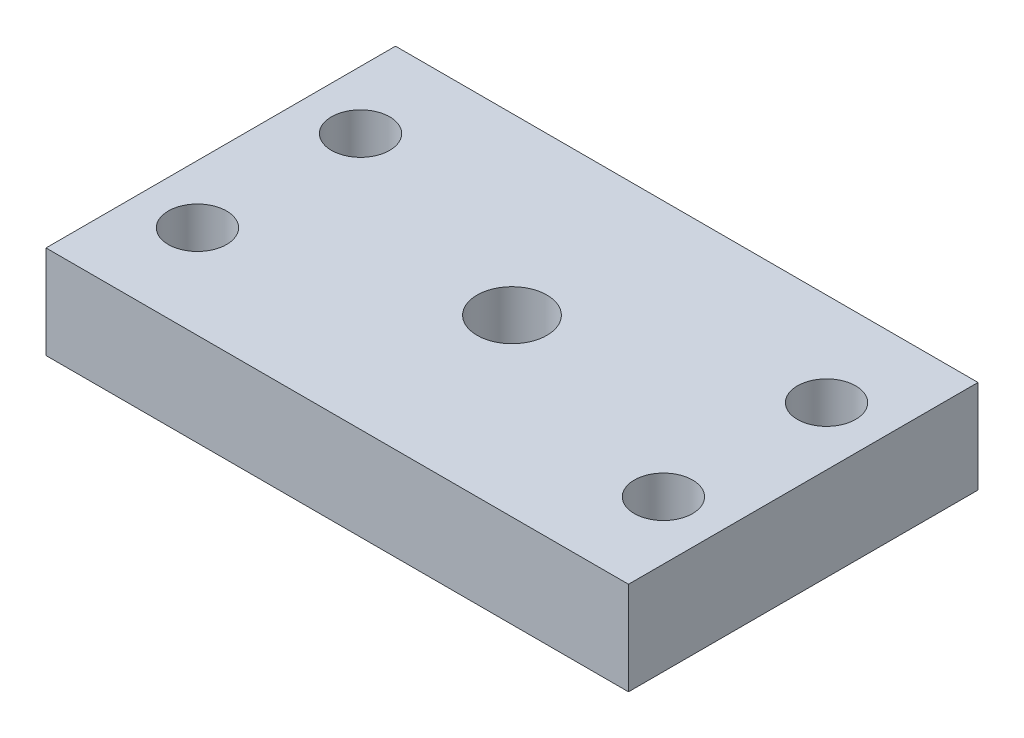
ISO-10303-21;
HEADER;
FILE_DESCRIPTION(('STEP AP214'),'2;1');
FILE_NAME('part.step','',(''),(''),'','','');
FILE_SCHEMA(('AUTOMOTIVE_DESIGN { 1 0 10303 214 1 1 1 1 }'));
ENDSEC;
DATA;
#1=APPLICATION_CONTEXT('core data for automotive mechanical design processes');
#2=APPLICATION_PROTOCOL_DEFINITION('international standard','automotive_design',2000,#1);
#3=PRODUCT_CONTEXT('',#1,'mechanical');
#4=PRODUCT('Part','Part','',(#3));
#5=PRODUCT_RELATED_PRODUCT_CATEGORY('part','',(#4));
#6=PRODUCT_DEFINITION_FORMATION('','',#4);
#7=PRODUCT_DEFINITION_CONTEXT('part definition',#1,'design');
#8=PRODUCT_DEFINITION('design','',#6,#7);
#9=PRODUCT_DEFINITION_SHAPE('','',#8);
#10=(LENGTH_UNIT() NAMED_UNIT(*) SI_UNIT(.MILLI.,.METRE.));
#11=(NAMED_UNIT(*) PLANE_ANGLE_UNIT() SI_UNIT($,.RADIAN.));
#12=(NAMED_UNIT(*) SI_UNIT($,.STERADIAN.) SOLID_ANGLE_UNIT());
#13=UNCERTAINTY_MEASURE_WITH_UNIT(LENGTH_MEASURE(1.E-05),#10,'distance_accuracy_value','');
#14=(GEOMETRIC_REPRESENTATION_CONTEXT(3) GLOBAL_UNCERTAINTY_ASSIGNED_CONTEXT((#13)) GLOBAL_UNIT_ASSIGNED_CONTEXT((#10,
#11,#12)) REPRESENTATION_CONTEXT('',''));
#15=CARTESIAN_POINT('',(0.,0.,0.));
#16=DIRECTION('',(0.,0.,1.));
#17=DIRECTION('',(1.,0.,0.));
#18=AXIS2_PLACEMENT_3D('',#15,#16,#17);
#19=CARTESIAN_POINT('',(0.,4.,0.));
#20=DIRECTION('',(1.,0.,0.));
#21=DIRECTION('',(0.,0.,-1.));
#22=AXIS2_PLACEMENT_3D('',#19,#20,#21);
#23=PLANE('',#22);
#24=DIRECTION('',(0.,0.,1.));
#25=VECTOR('',#24,1.);
#26=CARTESIAN_POINT('',(0.,0.,0.));
#27=LINE('',#26,#25);
#28=CARTESIAN_POINT('',(0.,0.,0.));
#29=VERTEX_POINT('',#28);
#30=CARTESIAN_POINT('',(0.,0.,15.));
#31=VERTEX_POINT('',#30);
#32=EDGE_CURVE('E100',#29,#31,#27,.T.);
#33=ORIENTED_EDGE('',*,*,#32,.T.);
#34=DIRECTION('',(0.,-1.,0.));
#35=VECTOR('',#34,1.);
#36=CARTESIAN_POINT('',(0.,4.,15.));
#37=LINE('',#36,#35);
#38=CARTESIAN_POINT('',(0.,4.,15.));
#39=VERTEX_POINT('',#38);
#40=EDGE_CURVE('E11',#39,#31,#37,.T.);
#41=ORIENTED_EDGE('',*,*,#40,.F.);
#42=DIRECTION('',(0.,0.,1.));
#43=VECTOR('',#42,1.);
#44=CARTESIAN_POINT('',(0.,4.,0.));
#45=LINE('',#44,#43);
#46=CARTESIAN_POINT('',(0.,4.,0.));
#47=VERTEX_POINT('',#46);
#48=EDGE_CURVE('E88',#47,#39,#45,.T.);
#49=ORIENTED_EDGE('',*,*,#48,.F.);
#50=DIRECTION('',(0.,-1.,0.));
#51=VECTOR('',#50,1.);
#52=CARTESIAN_POINT('',(0.,4.,0.));
#53=LINE('',#52,#51);
#54=EDGE_CURVE('E96',#47,#29,#53,.T.);
#55=ORIENTED_EDGE('',*,*,#54,.T.);
#56=EDGE_LOOP('',(#33,#41,#49,#55));
#57=FACE_BOUND('',#56,.T.);
#58=ADVANCED_FACE('F37',(#57),#23,.F.);
#59=CARTESIAN_POINT('',(0.,4.,15.));
#60=DIRECTION('',(0.,0.,-1.));
#61=DIRECTION('',(-1.,0.,0.));
#62=AXIS2_PLACEMENT_3D('',#59,#60,#61);
#63=PLANE('',#62);
#64=DIRECTION('',(1.,0.,0.));
#65=VECTOR('',#64,1.);
#66=CARTESIAN_POINT('',(0.,0.,15.));
#67=LINE('',#66,#65);
#68=CARTESIAN_POINT('',(25.,0.,15.));
#69=VERTEX_POINT('',#68);
#70=EDGE_CURVE('E92',#31,#69,#67,.T.);
#71=ORIENTED_EDGE('',*,*,#70,.T.);
#72=DIRECTION('',(0.,-1.,0.));
#73=VECTOR('',#72,1.);
#74=CARTESIAN_POINT('',(25.,4.,15.));
#75=LINE('',#74,#73);
#76=CARTESIAN_POINT('',(25.,4.,15.));
#77=VERTEX_POINT('',#76);
#78=EDGE_CURVE('E45',#77,#69,#75,.T.);
#79=ORIENTED_EDGE('',*,*,#78,.F.);
#80=DIRECTION('',(1.,0.,0.));
#81=VECTOR('',#80,1.);
#82=CARTESIAN_POINT('',(0.,4.,15.));
#83=LINE('',#82,#81);
#84=EDGE_CURVE('E83',#39,#77,#83,.T.);
#85=ORIENTED_EDGE('',*,*,#84,.F.);
#86=ORIENTED_EDGE('',*,*,#40,.T.);
#87=EDGE_LOOP('',(#71,#79,#85,#86));
#88=FACE_BOUND('',#87,.T.);
#89=ADVANCED_FACE('F91',(#88),#63,.F.);
#90=CARTESIAN_POINT('',(25.,4.,0.));
#91=DIRECTION('',(-1.,0.,0.));
#92=DIRECTION('',(0.,0.,1.));
#93=AXIS2_PLACEMENT_3D('',#90,#91,#92);
#94=PLANE('',#93);
#95=DIRECTION('',(0.,0.,-1.));
#96=VECTOR('',#95,1.);
#97=CARTESIAN_POINT('',(25.,0.,0.));
#98=LINE('',#97,#96);
#99=CARTESIAN_POINT('',(25.,0.,0.));
#100=VERTEX_POINT('',#99);
#101=EDGE_CURVE('E70',#69,#100,#98,.T.);
#102=ORIENTED_EDGE('',*,*,#101,.T.);
#103=DIRECTION('',(0.,-1.,0.));
#104=VECTOR('',#103,1.);
#105=CARTESIAN_POINT('',(25.,4.,0.));
#106=LINE('',#105,#104);
#107=CARTESIAN_POINT('',(25.,4.,0.));
#108=VERTEX_POINT('',#107);
#109=EDGE_CURVE('E93',#108,#100,#106,.T.);
#110=ORIENTED_EDGE('',*,*,#109,.F.);
#111=DIRECTION('',(0.,0.,-1.));
#112=VECTOR('',#111,1.);
#113=CARTESIAN_POINT('',(25.,4.,0.));
#114=LINE('',#113,#112);
#115=EDGE_CURVE('E86',#77,#108,#114,.T.);
#116=ORIENTED_EDGE('',*,*,#115,.F.);
#117=ORIENTED_EDGE('',*,*,#78,.T.);
#118=EDGE_LOOP('',(#102,#110,#116,#117));
#119=FACE_BOUND('',#118,.T.);
#120=ADVANCED_FACE('F94',(#119),#94,.F.);
#121=CARTESIAN_POINT('',(0.,4.,0.));
#122=DIRECTION('',(0.,0.,1.));
#123=DIRECTION('',(1.,0.,0.));
#124=AXIS2_PLACEMENT_3D('',#121,#122,#123);
#125=PLANE('',#124);
#126=DIRECTION('',(-1.,0.,0.));
#127=VECTOR('',#126,1.);
#128=CARTESIAN_POINT('',(0.,0.,0.));
#129=LINE('',#128,#127);
#130=EDGE_CURVE('E76',#100,#29,#129,.T.);
#131=ORIENTED_EDGE('',*,*,#130,.T.);
#132=ORIENTED_EDGE('',*,*,#54,.F.);
#133=DIRECTION('',(-1.,0.,0.));
#134=VECTOR('',#133,1.);
#135=CARTESIAN_POINT('',(0.,4.,0.));
#136=LINE('',#135,#134);
#137=EDGE_CURVE('E53',#108,#47,#136,.T.);
#138=ORIENTED_EDGE('',*,*,#137,.F.);
#139=ORIENTED_EDGE('',*,*,#109,.T.);
#140=EDGE_LOOP('',(#131,#132,#138,#139));
#141=FACE_BOUND('',#140,.T.);
#142=ADVANCED_FACE('F108',(#141),#125,.F.);
#143=CARTESIAN_POINT('',(0.,4.,0.));
#144=DIRECTION('',(0.,1.,0.));
#145=DIRECTION('',(0.,0.,1.));
#146=AXIS2_PLACEMENT_3D('',#143,#144,#145);
#147=PLANE('',#146);
#148=CARTESIAN_POINT('',(12.5,4.,7.5));
#149=DIRECTION('',(0.,1.,0.));
#150=DIRECTION('',(0.,0.,1.));
#151=AXIS2_PLACEMENT_3D('',#148,#149,#150);
#152=CIRCLE('',#151,1.5);
#153=CARTESIAN_POINT('',(12.5,4.,9.));
#154=VERTEX_POINT('',#153);
#155=EDGE_CURVE('E120',#154,#154,#152,.T.);
#156=ORIENTED_EDGE('',*,*,#155,.F.);
#157=EDGE_LOOP('',(#156));
#158=FACE_BOUND('',#157,.T.);
#159=CARTESIAN_POINT('',(22.5,4.,4.));
#160=DIRECTION('',(0.,1.,0.));
#161=DIRECTION('',(0.,0.,-1.));
#162=AXIS2_PLACEMENT_3D('',#159,#160,#161);
#163=CIRCLE('',#162,1.25);
#164=CARTESIAN_POINT('',(22.5,4.,2.75));
#165=VERTEX_POINT('',#164);
#166=EDGE_CURVE('E126',#165,#165,#163,.T.);
#167=ORIENTED_EDGE('',*,*,#166,.F.);
#168=EDGE_LOOP('',(#167));
#169=FACE_BOUND('',#168,.T.);
#170=CARTESIAN_POINT('',(22.5,4.,11.));
#171=DIRECTION('',(0.,1.,0.));
#172=DIRECTION('',(0.,0.,-1.));
#173=AXIS2_PLACEMENT_3D('',#170,#171,#172);
#174=CIRCLE('',#173,1.25);
#175=CARTESIAN_POINT('',(22.5,4.,9.75));
#176=VERTEX_POINT('',#175);
#177=EDGE_CURVE('E132',#176,#176,#174,.T.);
#178=ORIENTED_EDGE('',*,*,#177,.F.);
#179=EDGE_LOOP('',(#178));
#180=FACE_BOUND('',#179,.T.);
#181=CARTESIAN_POINT('',(2.5,4.,11.));
#182=DIRECTION('',(0.,1.,0.));
#183=DIRECTION('',(0.,0.,1.));
#184=AXIS2_PLACEMENT_3D('',#181,#182,#183);
#185=CIRCLE('',#184,1.25);
#186=CARTESIAN_POINT('',(2.5,4.,12.25));
#187=VERTEX_POINT('',#186);
#188=EDGE_CURVE('E138',#187,#187,#185,.T.);
#189=ORIENTED_EDGE('',*,*,#188,.F.);
#190=EDGE_LOOP('',(#189));
#191=FACE_BOUND('',#190,.T.);
#192=CARTESIAN_POINT('',(2.5,4.,4.));
#193=DIRECTION('',(0.,1.,0.));
#194=DIRECTION('',(0.,0.,1.));
#195=AXIS2_PLACEMENT_3D('',#192,#193,#194);
#196=CIRCLE('',#195,1.25);
#197=CARTESIAN_POINT('',(2.5,4.,5.25));
#198=VERTEX_POINT('',#197);
#199=EDGE_CURVE('E114',#198,#198,#196,.T.);
#200=ORIENTED_EDGE('',*,*,#199,.F.);
#201=EDGE_LOOP('',(#200));
#202=FACE_BOUND('',#201,.T.);
#203=ORIENTED_EDGE('',*,*,#48,.T.);
#204=ORIENTED_EDGE('',*,*,#84,.T.);
#205=ORIENTED_EDGE('',*,*,#115,.T.);
#206=ORIENTED_EDGE('',*,*,#137,.T.);
#207=EDGE_LOOP('',(#203,#204,#205,#206));
#208=FACE_BOUND('',#207,.T.);
#209=ADVANCED_FACE('F84',(#158,#169,#180,#191,#202,#208),#147,.T.);
#210=CARTESIAN_POINT('',(0.,0.,0.));
#211=DIRECTION('',(0.,1.,0.));
#212=DIRECTION('',(0.,0.,1.));
#213=AXIS2_PLACEMENT_3D('',#210,#211,#212);
#214=PLANE('',#213);
#215=CARTESIAN_POINT('',(12.5,0.,7.5));
#216=DIRECTION('',(0.,1.,0.));
#217=DIRECTION('',(0.,0.,1.));
#218=AXIS2_PLACEMENT_3D('',#215,#216,#217);
#219=CIRCLE('',#218,1.5);
#220=CARTESIAN_POINT('',(12.5,0.,9.));
#221=VERTEX_POINT('',#220);
#222=EDGE_CURVE('E123',#221,#221,#219,.T.);
#223=ORIENTED_EDGE('',*,*,#222,.T.);
#224=EDGE_LOOP('',(#223));
#225=FACE_BOUND('',#224,.T.);
#226=CARTESIAN_POINT('',(22.5,0.,4.));
#227=DIRECTION('',(0.,1.,0.));
#228=DIRECTION('',(0.,0.,-1.));
#229=AXIS2_PLACEMENT_3D('',#226,#227,#228);
#230=CIRCLE('',#229,1.25);
#231=CARTESIAN_POINT('',(22.5,0.,2.75));
#232=VERTEX_POINT('',#231);
#233=EDGE_CURVE('E129',#232,#232,#230,.T.);
#234=ORIENTED_EDGE('',*,*,#233,.T.);
#235=EDGE_LOOP('',(#234));
#236=FACE_BOUND('',#235,.T.);
#237=CARTESIAN_POINT('',(22.5,0.,11.));
#238=DIRECTION('',(0.,1.,0.));
#239=DIRECTION('',(0.,0.,-1.));
#240=AXIS2_PLACEMENT_3D('',#237,#238,#239);
#241=CIRCLE('',#240,1.25);
#242=CARTESIAN_POINT('',(22.5,0.,9.75));
#243=VERTEX_POINT('',#242);
#244=EDGE_CURVE('E135',#243,#243,#241,.T.);
#245=ORIENTED_EDGE('',*,*,#244,.T.);
#246=EDGE_LOOP('',(#245));
#247=FACE_BOUND('',#246,.T.);
#248=CARTESIAN_POINT('',(2.5,0.,11.));
#249=DIRECTION('',(0.,1.,0.));
#250=DIRECTION('',(0.,0.,1.));
#251=AXIS2_PLACEMENT_3D('',#248,#249,#250);
#252=CIRCLE('',#251,1.25);
#253=CARTESIAN_POINT('',(2.5,0.,12.25));
#254=VERTEX_POINT('',#253);
#255=EDGE_CURVE('E117',#254,#254,#252,.T.);
#256=ORIENTED_EDGE('',*,*,#255,.T.);
#257=EDGE_LOOP('',(#256));
#258=FACE_BOUND('',#257,.T.);
#259=CARTESIAN_POINT('',(2.5,0.,4.));
#260=DIRECTION('',(0.,1.,0.));
#261=DIRECTION('',(0.,0.,1.));
#262=AXIS2_PLACEMENT_3D('',#259,#260,#261);
#263=CIRCLE('',#262,1.25);
#264=CARTESIAN_POINT('',(2.5,0.,5.25));
#265=VERTEX_POINT('',#264);
#266=EDGE_CURVE('E103',#265,#265,#263,.T.);
#267=ORIENTED_EDGE('',*,*,#266,.T.);
#268=EDGE_LOOP('',(#267));
#269=FACE_BOUND('',#268,.T.);
#270=ORIENTED_EDGE('',*,*,#32,.F.);
#271=ORIENTED_EDGE('',*,*,#130,.F.);
#272=ORIENTED_EDGE('',*,*,#101,.F.);
#273=ORIENTED_EDGE('',*,*,#70,.F.);
#274=EDGE_LOOP('',(#270,#271,#272,#273));
#275=FACE_BOUND('',#274,.T.);
#276=ADVANCED_FACE('F111',(#225,#236,#247,#258,#269,#275),#214,.F.);
#277=CARTESIAN_POINT('',(2.5,0.,4.));
#278=DIRECTION('',(0.,1.,0.));
#279=DIRECTION('',(0.,0.,1.));
#280=AXIS2_PLACEMENT_3D('',#277,#278,#279);
#281=CYLINDRICAL_SURFACE('',#280,1.25);
#282=ORIENTED_EDGE('',*,*,#266,.F.);
#283=EDGE_LOOP('',(#282));
#284=FACE_BOUND('',#283,.T.);
#285=ORIENTED_EDGE('',*,*,#199,.T.);
#286=EDGE_LOOP('',(#285));
#287=FACE_BOUND('',#286,.T.);
#288=ADVANCED_FACE('F150',(#284,#287),#281,.F.);
#289=CARTESIAN_POINT('',(2.5,0.,11.));
#290=DIRECTION('',(0.,1.,0.));
#291=DIRECTION('',(0.,0.,1.));
#292=AXIS2_PLACEMENT_3D('',#289,#290,#291);
#293=CYLINDRICAL_SURFACE('',#292,1.25);
#294=ORIENTED_EDGE('',*,*,#255,.F.);
#295=EDGE_LOOP('',(#294));
#296=FACE_BOUND('',#295,.T.);
#297=ORIENTED_EDGE('',*,*,#188,.T.);
#298=EDGE_LOOP('',(#297));
#299=FACE_BOUND('',#298,.T.);
#300=ADVANCED_FACE('F146',(#296,#299),#293,.F.);
#301=CARTESIAN_POINT('',(22.5,0.,11.));
#302=DIRECTION('',(0.,1.,0.));
#303=DIRECTION('',(0.,0.,1.));
#304=AXIS2_PLACEMENT_3D('',#301,#302,#303);
#305=CYLINDRICAL_SURFACE('',#304,1.25);
#306=ORIENTED_EDGE('',*,*,#244,.F.);
#307=EDGE_LOOP('',(#306));
#308=FACE_BOUND('',#307,.T.);
#309=ORIENTED_EDGE('',*,*,#177,.T.);
#310=EDGE_LOOP('',(#309));
#311=FACE_BOUND('',#310,.T.);
#312=ADVANCED_FACE('F149',(#308,#311),#305,.F.);
#313=CARTESIAN_POINT('',(22.5,0.,4.));
#314=DIRECTION('',(0.,1.,0.));
#315=DIRECTION('',(0.,0.,1.));
#316=AXIS2_PLACEMENT_3D('',#313,#314,#315);
#317=CYLINDRICAL_SURFACE('',#316,1.25);
#318=ORIENTED_EDGE('',*,*,#233,.F.);
#319=EDGE_LOOP('',(#318));
#320=FACE_BOUND('',#319,.T.);
#321=ORIENTED_EDGE('',*,*,#166,.T.);
#322=EDGE_LOOP('',(#321));
#323=FACE_BOUND('',#322,.T.);
#324=ADVANCED_FACE('F211',(#320,#323),#317,.F.);
#325=CARTESIAN_POINT('',(12.5,0.,7.5));
#326=DIRECTION('',(0.,1.,0.));
#327=DIRECTION('',(0.,0.,1.));
#328=AXIS2_PLACEMENT_3D('',#325,#326,#327);
#329=CYLINDRICAL_SURFACE('',#328,1.5);
#330=ORIENTED_EDGE('',*,*,#222,.F.);
#331=EDGE_LOOP('',(#330));
#332=FACE_BOUND('',#331,.T.);
#333=ORIENTED_EDGE('',*,*,#155,.T.);
#334=EDGE_LOOP('',(#333));
#335=FACE_BOUND('',#334,.T.);
#336=ADVANCED_FACE('F221',(#332,#335),#329,.F.);
#337=CLOSED_SHELL('',(#58,#89,#120,#142,#209,#276,#288,#300,#312,#324,#336));
#338=MANIFOLD_SOLID_BREP('B2',#337);
#339=ADVANCED_BREP_SHAPE_REPRESENTATION('',(#18,#338),#14);
#340=SHAPE_DEFINITION_REPRESENTATION(#9,#339);
ENDSEC;
END-ISO-10303-21;
